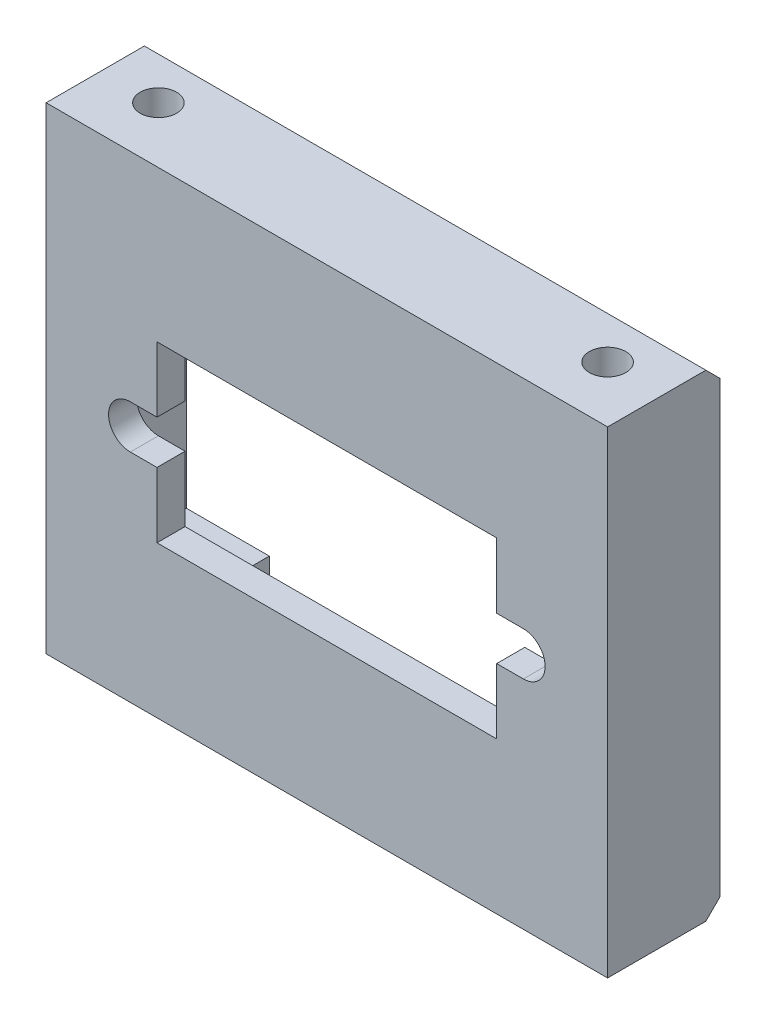
ISO-10303-21;
HEADER;
FILE_DESCRIPTION(('STEP AP214'),'2;1');
FILE_NAME('part.step','',(''),(''),'','','');
FILE_SCHEMA(('AUTOMOTIVE_DESIGN { 1 0 10303 214 1 1 1 1 }'));
ENDSEC;
DATA;
#1=APPLICATION_CONTEXT('core data for automotive mechanical design processes');
#2=APPLICATION_PROTOCOL_DEFINITION('international standard','automotive_design',2000,#1);
#3=PRODUCT_CONTEXT('',#1,'mechanical');
#4=PRODUCT('Part','Part','',(#3));
#5=PRODUCT_RELATED_PRODUCT_CATEGORY('part','',(#4));
#6=PRODUCT_DEFINITION_FORMATION('','',#4);
#7=PRODUCT_DEFINITION_CONTEXT('part definition',#1,'design');
#8=PRODUCT_DEFINITION('design','',#6,#7);
#9=PRODUCT_DEFINITION_SHAPE('','',#8);
#10=(LENGTH_UNIT() NAMED_UNIT(*) SI_UNIT(.MILLI.,.METRE.));
#11=(NAMED_UNIT(*) PLANE_ANGLE_UNIT() SI_UNIT($,.RADIAN.));
#12=(NAMED_UNIT(*) SI_UNIT($,.STERADIAN.) SOLID_ANGLE_UNIT());
#13=UNCERTAINTY_MEASURE_WITH_UNIT(LENGTH_MEASURE(1.E-05),#10,'distance_accuracy_value','');
#14=(GEOMETRIC_REPRESENTATION_CONTEXT(3) GLOBAL_UNCERTAINTY_ASSIGNED_CONTEXT((#13)) GLOBAL_UNIT_ASSIGNED_CONTEXT((#10,
#11,#12)) REPRESENTATION_CONTEXT('',''));
#15=CARTESIAN_POINT('',(0.,0.,0.));
#16=DIRECTION('',(0.,0.,1.));
#17=DIRECTION('',(1.,0.,0.));
#18=AXIS2_PLACEMENT_3D('',#15,#16,#17);
#19=CARTESIAN_POINT('',(0.,0.,0.));
#20=DIRECTION('',(0.,0.,1.));
#21=DIRECTION('',(1.,0.,0.));
#22=AXIS2_PLACEMENT_3D('',#19,#20,#21);
#23=PLANE('',#22);
#24=DIRECTION('',(0.,-1.,0.));
#25=VECTOR('',#24,1.);
#26=CARTESIAN_POINT('',(-12.1,6.2,0.));
#27=LINE('',#26,#25);
#28=CARTESIAN_POINT('',(-12.1,-1.55,0.));
#29=VERTEX_POINT('',#28);
#30=CARTESIAN_POINT('',(-12.1,-6.2,0.));
#31=VERTEX_POINT('',#30);
#32=EDGE_CURVE('E419',#29,#31,#27,.T.);
#33=ORIENTED_EDGE('',*,*,#32,.T.);
#34=DIRECTION('',(1.,0.,0.));
#35=VECTOR('',#34,1.);
#36=CARTESIAN_POINT('',(-12.1,-6.2,0.));
#37=LINE('',#36,#35);
#38=CARTESIAN_POINT('',(12.1,-6.2,0.));
#39=VERTEX_POINT('',#38);
#40=EDGE_CURVE('E418',#31,#39,#37,.T.);
#41=ORIENTED_EDGE('',*,*,#40,.T.);
#42=DIRECTION('',(0.,-1.,0.));
#43=VECTOR('',#42,1.);
#44=CARTESIAN_POINT('',(12.1,6.2,0.));
#45=LINE('',#44,#43);
#46=CARTESIAN_POINT('',(12.1,-1.55,0.));
#47=VERTEX_POINT('',#46);
#48=EDGE_CURVE('E423',#47,#39,#45,.T.);
#49=ORIENTED_EDGE('',*,*,#48,.F.);
#50=DIRECTION('',(1.,0.,0.));
#51=VECTOR('',#50,1.);
#52=CARTESIAN_POINT('',(0.,-1.55,0.));
#53=LINE('',#52,#51);
#54=CARTESIAN_POINT('',(14.,-1.55,0.));
#55=VERTEX_POINT('',#54);
#56=EDGE_CURVE('E343',#47,#55,#53,.T.);
#57=ORIENTED_EDGE('',*,*,#56,.T.);
#58=CARTESIAN_POINT('',(14.,0.,0.));
#59=DIRECTION('',(0.,0.,1.));
#60=DIRECTION('',(1.,0.,0.));
#61=AXIS2_PLACEMENT_3D('',#58,#59,#60);
#62=CIRCLE('',#61,1.55);
#63=CARTESIAN_POINT('',(14.,1.55,0.));
#64=VERTEX_POINT('',#63);
#65=EDGE_CURVE('E348',#64,#55,#62,.F.);
#66=ORIENTED_EDGE('',*,*,#65,.F.);
#67=DIRECTION('',(1.,0.,0.));
#68=VECTOR('',#67,1.);
#69=CARTESIAN_POINT('',(0.,1.55,0.));
#70=LINE('',#69,#68);
#71=CARTESIAN_POINT('',(12.1,1.55,0.));
#72=VERTEX_POINT('',#71);
#73=EDGE_CURVE('E340',#72,#64,#70,.T.);
#74=ORIENTED_EDGE('',*,*,#73,.F.);
#75=CARTESIAN_POINT('',(12.1,6.2,0.));
#76=VERTEX_POINT('',#75);
#77=EDGE_CURVE('E424',#76,#72,#45,.T.);
#78=ORIENTED_EDGE('',*,*,#77,.F.);
#79=DIRECTION('',(1.,0.,0.));
#80=VECTOR('',#79,1.);
#81=CARTESIAN_POINT('',(-12.1,6.2,0.));
#82=LINE('',#81,#80);
#83=CARTESIAN_POINT('',(-12.1,6.2,0.));
#84=VERTEX_POINT('',#83);
#85=EDGE_CURVE('E428',#84,#76,#82,.T.);
#86=ORIENTED_EDGE('',*,*,#85,.F.);
#87=CARTESIAN_POINT('',(-12.1,1.55,0.));
#88=VERTEX_POINT('',#87);
#89=EDGE_CURVE('E414',#84,#88,#27,.T.);
#90=ORIENTED_EDGE('',*,*,#89,.T.);
#91=DIRECTION('',(1.,0.,0.));
#92=VECTOR('',#91,1.);
#93=CARTESIAN_POINT('',(0.,1.55,0.));
#94=LINE('',#93,#92);
#95=CARTESIAN_POINT('',(-14.,1.55,0.));
#96=VERTEX_POINT('',#95);
#97=EDGE_CURVE('E378',#96,#88,#94,.T.);
#98=ORIENTED_EDGE('',*,*,#97,.F.);
#99=CARTESIAN_POINT('',(-14.,0.,0.));
#100=DIRECTION('',(0.,0.,1.));
#101=DIRECTION('',(1.,0.,0.));
#102=AXIS2_PLACEMENT_3D('',#99,#100,#101);
#103=CIRCLE('',#102,1.55);
#104=CARTESIAN_POINT('',(-14.,-1.55,0.));
#105=VERTEX_POINT('',#104);
#106=EDGE_CURVE('E382',#96,#105,#103,.T.);
#107=ORIENTED_EDGE('',*,*,#106,.T.);
#108=DIRECTION('',(1.,0.,0.));
#109=VECTOR('',#108,1.);
#110=CARTESIAN_POINT('',(0.,-1.55,0.));
#111=LINE('',#110,#109);
#112=EDGE_CURVE('E387',#105,#29,#111,.T.);
#113=ORIENTED_EDGE('',*,*,#112,.T.);
#114=EDGE_LOOP('',(#33,#41,#49,#57,#66,#74,#78,#86,#90,#98,#107,#113));
#115=FACE_BOUND('',#114,.T.);
#116=DIRECTION('',(1.,0.,0.));
#117=VECTOR('',#116,1.);
#118=CARTESIAN_POINT('',(18.,-11.02,0.));
#119=LINE('',#118,#117);
#120=CARTESIAN_POINT('',(12.1,-11.02,0.));
#121=VERTEX_POINT('',#120);
#122=CARTESIAN_POINT('',(18.,-11.02,0.));
#123=VERTEX_POINT('',#122);
#124=EDGE_CURVE('E725',#121,#123,#119,.T.);
#125=ORIENTED_EDGE('',*,*,#124,.F.);
#126=DIRECTION('',(0.,1.,0.));
#127=VECTOR('',#126,1.);
#128=CARTESIAN_POINT('',(12.1,-15.02,0.));
#129=LINE('',#128,#127);
#130=CARTESIAN_POINT('',(12.1,-15.02,0.));
#131=VERTEX_POINT('',#130);
#132=EDGE_CURVE('E708',#131,#121,#129,.T.);
#133=ORIENTED_EDGE('',*,*,#132,.F.);
#134=DIRECTION('',(1.,0.,0.));
#135=VECTOR('',#134,1.);
#136=CARTESIAN_POINT('',(18.,-15.02,0.));
#137=LINE('',#136,#135);
#138=CARTESIAN_POINT('',(-12.1,-15.02,0.));
#139=VERTEX_POINT('',#138);
#140=EDGE_CURVE('E308',#139,#131,#137,.T.);
#141=ORIENTED_EDGE('',*,*,#140,.F.);
#142=DIRECTION('',(0.,-1.,0.));
#143=VECTOR('',#142,1.);
#144=CARTESIAN_POINT('',(-12.1,-15.02,0.));
#145=LINE('',#144,#143);
#146=CARTESIAN_POINT('',(-12.1,-11.02,0.));
#147=VERTEX_POINT('',#146);
#148=EDGE_CURVE('E699',#147,#139,#145,.T.);
#149=ORIENTED_EDGE('',*,*,#148,.F.);
#150=DIRECTION('',(1.,0.,0.));
#151=VECTOR('',#150,1.);
#152=CARTESIAN_POINT('',(-18.,-11.02,0.));
#153=LINE('',#152,#151);
#154=CARTESIAN_POINT('',(-18.,-11.02,0.));
#155=VERTEX_POINT('',#154);
#156=EDGE_CURVE('E283',#155,#147,#153,.T.);
#157=ORIENTED_EDGE('',*,*,#156,.F.);
#158=DIRECTION('',(0.,-1.,0.));
#159=VECTOR('',#158,1.);
#160=CARTESIAN_POINT('',(-18.,17.,0.));
#161=LINE('',#160,#159);
#162=CARTESIAN_POINT('',(-18.,11.02,0.));
#163=VERTEX_POINT('',#162);
#164=EDGE_CURVE('E325',#163,#155,#161,.T.);
#165=ORIENTED_EDGE('',*,*,#164,.F.);
#166=DIRECTION('',(-1.,0.,0.));
#167=VECTOR('',#166,1.);
#168=CARTESIAN_POINT('',(-18.,11.02,0.));
#169=LINE('',#168,#167);
#170=CARTESIAN_POINT('',(-12.1,11.02,0.));
#171=VERTEX_POINT('',#170);
#172=EDGE_CURVE('E681',#171,#163,#169,.T.);
#173=ORIENTED_EDGE('',*,*,#172,.F.);
#174=DIRECTION('',(0.,-1.,0.));
#175=VECTOR('',#174,1.);
#176=CARTESIAN_POINT('',(-12.1,15.02,0.));
#177=LINE('',#176,#175);
#178=CARTESIAN_POINT('',(-12.1,15.02,0.));
#179=VERTEX_POINT('',#178);
#180=EDGE_CURVE('E684',#179,#171,#177,.T.);
#181=ORIENTED_EDGE('',*,*,#180,.F.);
#182=DIRECTION('',(-1.,0.,0.));
#183=VECTOR('',#182,1.);
#184=CARTESIAN_POINT('',(18.,15.02,0.));
#185=LINE('',#184,#183);
#186=CARTESIAN_POINT('',(12.1,15.02,0.));
#187=VERTEX_POINT('',#186);
#188=EDGE_CURVE('E292',#187,#179,#185,.T.);
#189=ORIENTED_EDGE('',*,*,#188,.F.);
#190=DIRECTION('',(0.,1.,0.));
#191=VECTOR('',#190,1.);
#192=CARTESIAN_POINT('',(12.1,15.02,0.));
#193=LINE('',#192,#191);
#194=CARTESIAN_POINT('',(12.1,11.02,0.));
#195=VERTEX_POINT('',#194);
#196=EDGE_CURVE('E739',#195,#187,#193,.T.);
#197=ORIENTED_EDGE('',*,*,#196,.F.);
#198=DIRECTION('',(-1.,0.,0.));
#199=VECTOR('',#198,1.);
#200=CARTESIAN_POINT('',(18.,11.02,0.));
#201=LINE('',#200,#199);
#202=CARTESIAN_POINT('',(18.,11.02,0.));
#203=VERTEX_POINT('',#202);
#204=EDGE_CURVE('E686',#203,#195,#201,.T.);
#205=ORIENTED_EDGE('',*,*,#204,.F.);
#206=DIRECTION('',(0.,1.,0.));
#207=VECTOR('',#206,1.);
#208=CARTESIAN_POINT('',(18.,17.,0.));
#209=LINE('',#208,#207);
#210=EDGE_CURVE('E333',#123,#203,#209,.T.);
#211=ORIENTED_EDGE('',*,*,#210,.F.);
#212=EDGE_LOOP('',(#125,#133,#141,#149,#157,#165,#173,#181,#189,#197,#205,#211));
#213=FACE_BOUND('',#212,.T.);
#214=ADVANCED_FACE('F71',(#115,#213),#23,.F.);
#215=CARTESIAN_POINT('',(18.,17.,-6.));
#216=DIRECTION('',(1.,0.,0.));
#217=DIRECTION('',(0.,1.,0.));
#218=AXIS2_PLACEMENT_3D('',#215,#216,#217);
#219=PLANE('',#218);
#220=DIRECTION('',(0.,0.,1.));
#221=VECTOR('',#220,1.);
#222=CARTESIAN_POINT('',(18.,-11.02,-13.1281133548787));
#223=LINE('',#222,#221);
#224=CARTESIAN_POINT('',(18.,-11.02,-6.));
#225=VERTEX_POINT('',#224);
#226=EDGE_CURVE('E721',#225,#123,#223,.T.);
#227=ORIENTED_EDGE('',*,*,#226,.T.);
#228=ORIENTED_EDGE('',*,*,#210,.T.);
#229=DIRECTION('',(0.,0.,1.));
#230=VECTOR('',#229,1.);
#231=CARTESIAN_POINT('',(18.,11.02,-13.1281133548787));
#232=LINE('',#231,#230);
#233=CARTESIAN_POINT('',(18.,11.02,-6.));
#234=VERTEX_POINT('',#233);
#235=EDGE_CURVE('E733',#234,#203,#232,.T.);
#236=ORIENTED_EDGE('',*,*,#235,.F.);
#237=DIRECTION('',(0.,1.,0.));
#238=VECTOR('',#237,1.);
#239=CARTESIAN_POINT('',(18.,17.,-6.));
#240=LINE('',#239,#238);
#241=EDGE_CURVE('E301',#225,#234,#240,.T.);
#242=ORIENTED_EDGE('',*,*,#241,.F.);
#243=EDGE_LOOP('',(#227,#228,#236,#242));
#244=FACE_BOUND('',#243,.T.);
#245=ADVANCED_FACE('F554',(#244),#219,.F.);
#246=CARTESIAN_POINT('',(-18.,17.,-6.));
#247=DIRECTION('',(-1.,0.,0.));
#248=DIRECTION('',(0.,-1.,0.));
#249=AXIS2_PLACEMENT_3D('',#246,#247,#248);
#250=PLANE('',#249);
#251=DIRECTION('',(0.,0.,1.));
#252=VECTOR('',#251,1.);
#253=CARTESIAN_POINT('',(-18.,-11.02,-13.1281133548787));
#254=LINE('',#253,#252);
#255=CARTESIAN_POINT('',(-18.,-11.02,-6.));
#256=VERTEX_POINT('',#255);
#257=EDGE_CURVE('E688',#256,#155,#254,.T.);
#258=ORIENTED_EDGE('',*,*,#257,.F.);
#259=DIRECTION('',(0.,-1.,0.));
#260=VECTOR('',#259,1.);
#261=CARTESIAN_POINT('',(-18.,17.,-6.));
#262=LINE('',#261,#260);
#263=CARTESIAN_POINT('',(-18.,11.02,-6.));
#264=VERTEX_POINT('',#263);
#265=EDGE_CURVE('E324',#264,#256,#262,.T.);
#266=ORIENTED_EDGE('',*,*,#265,.F.);
#267=DIRECTION('',(0.,0.,1.));
#268=VECTOR('',#267,1.);
#269=CARTESIAN_POINT('',(-18.,11.02,-13.1281133548787));
#270=LINE('',#269,#268);
#271=EDGE_CURVE('E677',#264,#163,#270,.T.);
#272=ORIENTED_EDGE('',*,*,#271,.T.);
#273=ORIENTED_EDGE('',*,*,#164,.T.);
#274=EDGE_LOOP('',(#258,#266,#272,#273));
#275=FACE_BOUND('',#274,.T.);
#276=ADVANCED_FACE('F560',(#275),#250,.F.);
#277=CARTESIAN_POINT('',(18.,-15.02,-42.0544088843514));
#278=DIRECTION('',(0.,-1.,0.));
#279=DIRECTION('',(0.,0.,-1.));
#280=AXIS2_PLACEMENT_3D('',#277,#278,#279);
#281=PLANE('',#280);
#282=DIRECTION('',(0.,0.,1.));
#283=VECTOR('',#282,1.);
#284=CARTESIAN_POINT('',(12.1,-15.02,-13.1281133548787));
#285=LINE('',#284,#283);
#286=CARTESIAN_POINT('',(12.1,-15.02,-6.));
#287=VERTEX_POINT('',#286);
#288=EDGE_CURVE('E715',#287,#131,#285,.T.);
#289=ORIENTED_EDGE('',*,*,#288,.F.);
#290=DIRECTION('',(1.,0.,0.));
#291=VECTOR('',#290,1.);
#292=CARTESIAN_POINT('',(18.,-15.02,-6.));
#293=LINE('',#292,#291);
#294=CARTESIAN_POINT('',(-12.1,-15.02,-6.));
#295=VERTEX_POINT('',#294);
#296=EDGE_CURVE('E312',#295,#287,#293,.T.);
#297=ORIENTED_EDGE('',*,*,#296,.F.);
#298=DIRECTION('',(0.,0.,1.));
#299=VECTOR('',#298,1.);
#300=CARTESIAN_POINT('',(-12.1,-15.02,-13.1281133548787));
#301=LINE('',#300,#299);
#302=EDGE_CURVE('E695',#295,#139,#301,.T.);
#303=ORIENTED_EDGE('',*,*,#302,.T.);
#304=ORIENTED_EDGE('',*,*,#140,.T.);
#305=EDGE_LOOP('',(#289,#297,#303,#304));
#306=FACE_BOUND('',#305,.T.);
#307=ADVANCED_FACE('F607',(#306),#281,.F.);
#308=CARTESIAN_POINT('',(18.,15.02,-42.0544088843514));
#309=DIRECTION('',(0.,1.,0.));
#310=DIRECTION('',(-1.,0.,0.));
#311=AXIS2_PLACEMENT_3D('',#308,#309,#310);
#312=PLANE('',#311);
#313=DIRECTION('',(0.,0.,1.));
#314=VECTOR('',#313,1.);
#315=CARTESIAN_POINT('',(-12.1,15.02,-13.1281133548787));
#316=LINE('',#315,#314);
#317=CARTESIAN_POINT('',(-12.1,15.02,-6.));
#318=VERTEX_POINT('',#317);
#319=EDGE_CURVE('E275',#318,#179,#316,.T.);
#320=ORIENTED_EDGE('',*,*,#319,.F.);
#321=DIRECTION('',(-1.,0.,0.));
#322=VECTOR('',#321,1.);
#323=CARTESIAN_POINT('',(18.,15.02,-6.));
#324=LINE('',#323,#322);
#325=CARTESIAN_POINT('',(12.1,15.02,-6.));
#326=VERTEX_POINT('',#325);
#327=EDGE_CURVE('E290',#326,#318,#324,.T.);
#328=ORIENTED_EDGE('',*,*,#327,.F.);
#329=DIRECTION('',(0.,0.,1.));
#330=VECTOR('',#329,1.);
#331=CARTESIAN_POINT('',(12.1,15.02,-13.1281133548787));
#332=LINE('',#331,#330);
#333=EDGE_CURVE('E742',#326,#187,#332,.T.);
#334=ORIENTED_EDGE('',*,*,#333,.T.);
#335=ORIENTED_EDGE('',*,*,#188,.T.);
#336=EDGE_LOOP('',(#320,#328,#334,#335));
#337=FACE_BOUND('',#336,.T.);
#338=ADVANCED_FACE('F288',(#337),#312,.F.);
#339=CARTESIAN_POINT('',(20.,17.,2.));
#340=DIRECTION('',(-1.,0.,0.));
#341=DIRECTION('',(0.,-1.,0.));
#342=AXIS2_PLACEMENT_3D('',#339,#340,#341);
#343=PLANE('',#342);
#344=DIRECTION('',(0.,-1.,0.));
#345=VECTOR('',#344,1.);
#346=CARTESIAN_POINT('',(20.,17.,-6.));
#347=LINE('',#346,#345);
#348=CARTESIAN_POINT('',(20.,16.,-6.));
#349=VERTEX_POINT('',#348);
#350=CARTESIAN_POINT('',(20.,-16.,-6.));
#351=VERTEX_POINT('',#350);
#352=EDGE_CURVE('E306',#349,#351,#347,.T.);
#353=ORIENTED_EDGE('',*,*,#352,.F.);
#354=DIRECTION('',(0.,-0.707106781186548,-0.707106781186548));
#355=VECTOR('',#354,1.);
#356=CARTESIAN_POINT('',(20.,16.,-6.));
#357=LINE('',#356,#355);
#358=CARTESIAN_POINT('',(20.,17.,-4.99999999999999));
#359=VERTEX_POINT('',#358);
#360=EDGE_CURVE('E508',#349,#359,#357,.F.);
#361=ORIENTED_EDGE('',*,*,#360,.T.);
#362=DIRECTION('',(0.,0.,-1.));
#363=VECTOR('',#362,1.);
#364=CARTESIAN_POINT('',(20.,17.,2.));
#365=LINE('',#364,#363);
#366=CARTESIAN_POINT('',(20.,17.,2.));
#367=VERTEX_POINT('',#366);
#368=EDGE_CURVE('E483',#367,#359,#365,.T.);
#369=ORIENTED_EDGE('',*,*,#368,.F.);
#370=DIRECTION('',(0.,1.,0.));
#371=VECTOR('',#370,1.);
#372=CARTESIAN_POINT('',(20.,17.,2.));
#373=LINE('',#372,#371);
#374=CARTESIAN_POINT('',(20.,-17.,2.));
#375=VERTEX_POINT('',#374);
#376=EDGE_CURVE('E368',#375,#367,#373,.T.);
#377=ORIENTED_EDGE('',*,*,#376,.F.);
#378=DIRECTION('',(0.,0.,-1.));
#379=VECTOR('',#378,1.);
#380=CARTESIAN_POINT('',(20.,-17.,2.));
#381=LINE('',#380,#379);
#382=CARTESIAN_POINT('',(20.,-17.,-4.99999999999999));
#383=VERTEX_POINT('',#382);
#384=EDGE_CURVE('E473',#375,#383,#381,.T.);
#385=ORIENTED_EDGE('',*,*,#384,.T.);
#386=DIRECTION('',(0.,-0.707106781186548,0.707106781186548));
#387=VECTOR('',#386,1.);
#388=CARTESIAN_POINT('',(20.,-16.,-6.));
#389=LINE('',#388,#387);
#390=EDGE_CURVE('E505',#383,#351,#389,.F.);
#391=ORIENTED_EDGE('',*,*,#390,.T.);
#392=EDGE_LOOP('',(#353,#361,#369,#377,#385,#391));
#393=FACE_BOUND('',#392,.T.);
#394=ADVANCED_FACE('F525',(#393),#343,.F.);
#395=CARTESIAN_POINT('',(-20.,17.,2.));
#396=DIRECTION('',(0.,-1.,0.));
#397=DIRECTION('',(0.,0.,-1.));
#398=AXIS2_PLACEMENT_3D('',#395,#396,#397);
#399=PLANE('',#398);
#400=CARTESIAN_POINT('',(-16.,17.,-2.));
#401=DIRECTION('',(0.,1.,0.));
#402=DIRECTION('',(0.,0.,1.));
#403=AXIS2_PLACEMENT_3D('',#400,#401,#402);
#404=CIRCLE('',#403,1.3);
#405=CARTESIAN_POINT('',(-16.,17.,-0.699999999999996));
#406=VERTEX_POINT('',#405);
#407=EDGE_CURVE('E661',#406,#406,#404,.T.);
#408=ORIENTED_EDGE('',*,*,#407,.F.);
#409=EDGE_LOOP('',(#408));
#410=FACE_BOUND('',#409,.T.);
#411=CARTESIAN_POINT('',(16.,17.,-2.));
#412=DIRECTION('',(0.,1.,0.));
#413=DIRECTION('',(0.,0.,1.));
#414=AXIS2_PLACEMENT_3D('',#411,#412,#413);
#415=CIRCLE('',#414,1.3);
#416=CARTESIAN_POINT('',(16.,17.,-0.699999999999998));
#417=VERTEX_POINT('',#416);
#418=EDGE_CURVE('E780',#417,#417,#415,.T.);
#419=ORIENTED_EDGE('',*,*,#418,.F.);
#420=EDGE_LOOP('',(#419));
#421=FACE_BOUND('',#420,.T.);
#422=ORIENTED_EDGE('',*,*,#368,.T.);
#423=DIRECTION('',(-1.,0.,0.));
#424=VECTOR('',#423,1.);
#425=CARTESIAN_POINT('',(-20.,17.,-4.99999999999999));
#426=LINE('',#425,#424);
#427=CARTESIAN_POINT('',(-20.,17.,-4.99999999999999));
#428=VERTEX_POINT('',#427);
#429=EDGE_CURVE('E96',#359,#428,#426,.T.);
#430=ORIENTED_EDGE('',*,*,#429,.T.);
#431=DIRECTION('',(0.,0.,-1.));
#432=VECTOR('',#431,1.);
#433=CARTESIAN_POINT('',(-20.,17.,2.));
#434=LINE('',#433,#432);
#435=CARTESIAN_POINT('',(-20.,17.,2.));
#436=VERTEX_POINT('',#435);
#437=EDGE_CURVE('E480',#436,#428,#434,.T.);
#438=ORIENTED_EDGE('',*,*,#437,.F.);
#439=DIRECTION('',(-1.,0.,0.));
#440=VECTOR('',#439,1.);
#441=CARTESIAN_POINT('',(-20.,17.,2.));
#442=LINE('',#441,#440);
#443=EDGE_CURVE('E464',#367,#436,#442,.T.);
#444=ORIENTED_EDGE('',*,*,#443,.F.);
#445=EDGE_LOOP('',(#422,#430,#438,#444));
#446=FACE_BOUND('',#445,.T.);
#447=ADVANCED_FACE('F527',(#410,#421,#446),#399,.F.);
#448=CARTESIAN_POINT('',(-20.,17.,2.));
#449=DIRECTION('',(1.,0.,0.));
#450=DIRECTION('',(0.,1.,0.));
#451=AXIS2_PLACEMENT_3D('',#448,#449,#450);
#452=PLANE('',#451);
#453=ORIENTED_EDGE('',*,*,#437,.T.);
#454=DIRECTION('',(0.,0.707106781186548,0.707106781186548));
#455=VECTOR('',#454,1.);
#456=CARTESIAN_POINT('',(-20.,16.,-6.));
#457=LINE('',#456,#455);
#458=CARTESIAN_POINT('',(-20.,16.,-6.));
#459=VERTEX_POINT('',#458);
#460=EDGE_CURVE('E81',#428,#459,#457,.F.);
#461=ORIENTED_EDGE('',*,*,#460,.T.);
#462=DIRECTION('',(0.,1.,0.));
#463=VECTOR('',#462,1.);
#464=CARTESIAN_POINT('',(-20.,17.,-6.));
#465=LINE('',#464,#463);
#466=CARTESIAN_POINT('',(-20.,-16.,-6.));
#467=VERTEX_POINT('',#466);
#468=EDGE_CURVE('E320',#467,#459,#465,.T.);
#469=ORIENTED_EDGE('',*,*,#468,.F.);
#470=DIRECTION('',(0.,0.707106781186548,-0.707106781186548));
#471=VECTOR('',#470,1.);
#472=CARTESIAN_POINT('',(-20.,-16.,-6.));
#473=LINE('',#472,#471);
#474=CARTESIAN_POINT('',(-20.,-17.,-4.99999999999999));
#475=VERTEX_POINT('',#474);
#476=EDGE_CURVE('E88',#467,#475,#473,.F.);
#477=ORIENTED_EDGE('',*,*,#476,.T.);
#478=DIRECTION('',(0.,0.,-1.));
#479=VECTOR('',#478,1.);
#480=CARTESIAN_POINT('',(-20.,-17.,2.));
#481=LINE('',#480,#479);
#482=CARTESIAN_POINT('',(-20.,-17.,2.));
#483=VERTEX_POINT('',#482);
#484=EDGE_CURVE('E477',#483,#475,#481,.T.);
#485=ORIENTED_EDGE('',*,*,#484,.F.);
#486=DIRECTION('',(0.,-1.,0.));
#487=VECTOR('',#486,1.);
#488=CARTESIAN_POINT('',(-20.,17.,2.));
#489=LINE('',#488,#487);
#490=EDGE_CURVE('E467',#436,#483,#489,.T.);
#491=ORIENTED_EDGE('',*,*,#490,.F.);
#492=EDGE_LOOP('',(#453,#461,#469,#477,#485,#491));
#493=FACE_BOUND('',#492,.T.);
#494=ADVANCED_FACE('F516',(#493),#452,.F.);
#495=CARTESIAN_POINT('',(-20.,-17.,2.));
#496=DIRECTION('',(0.,1.,0.));
#497=DIRECTION('',(0.,0.,1.));
#498=AXIS2_PLACEMENT_3D('',#495,#496,#497);
#499=PLANE('',#498);
#500=CARTESIAN_POINT('',(-16.,-17.,-2.));
#501=DIRECTION('',(0.,1.,0.));
#502=DIRECTION('',(0.,0.,1.));
#503=AXIS2_PLACEMENT_3D('',#500,#501,#502);
#504=CIRCLE('',#503,1.3);
#505=CARTESIAN_POINT('',(-16.,-17.,-0.699999999999996));
#506=VERTEX_POINT('',#505);
#507=EDGE_CURVE('E492',#506,#506,#504,.T.);
#508=ORIENTED_EDGE('',*,*,#507,.T.);
#509=EDGE_LOOP('',(#508));
#510=FACE_BOUND('',#509,.T.);
#511=CARTESIAN_POINT('',(16.,-17.,-2.));
#512=DIRECTION('',(0.,1.,0.));
#513=DIRECTION('',(0.,0.,1.));
#514=AXIS2_PLACEMENT_3D('',#511,#512,#513);
#515=CIRCLE('',#514,1.3);
#516=CARTESIAN_POINT('',(16.,-17.,-0.699999999999998));
#517=VERTEX_POINT('',#516);
#518=EDGE_CURVE('E776',#517,#517,#515,.T.);
#519=ORIENTED_EDGE('',*,*,#518,.T.);
#520=EDGE_LOOP('',(#519));
#521=FACE_BOUND('',#520,.T.);
#522=ORIENTED_EDGE('',*,*,#484,.T.);
#523=DIRECTION('',(1.,0.,0.));
#524=VECTOR('',#523,1.);
#525=CARTESIAN_POINT('',(-20.,-17.,-4.99999999999999));
#526=LINE('',#525,#524);
#527=EDGE_CURVE('E12',#475,#383,#526,.T.);
#528=ORIENTED_EDGE('',*,*,#527,.T.);
#529=ORIENTED_EDGE('',*,*,#384,.F.);
#530=DIRECTION('',(1.,0.,0.));
#531=VECTOR('',#530,1.);
#532=CARTESIAN_POINT('',(-20.,-17.,2.));
#533=LINE('',#532,#531);
#534=EDGE_CURVE('E470',#483,#375,#533,.T.);
#535=ORIENTED_EDGE('',*,*,#534,.F.);
#536=EDGE_LOOP('',(#522,#528,#529,#535));
#537=FACE_BOUND('',#536,.T.);
#538=ADVANCED_FACE('F536',(#510,#521,#537),#499,.F.);
#539=CARTESIAN_POINT('',(0.,0.,2.));
#540=DIRECTION('',(0.,0.,1.));
#541=DIRECTION('',(1.,0.,0.));
#542=AXIS2_PLACEMENT_3D('',#539,#540,#541);
#543=PLANE('',#542);
#544=DIRECTION('',(1.,0.,0.));
#545=VECTOR('',#544,1.);
#546=CARTESIAN_POINT('',(-12.1,-6.2,2.));
#547=LINE('',#546,#545);
#548=CARTESIAN_POINT('',(-12.1,-6.2,2.));
#549=VERTEX_POINT('',#548);
#550=CARTESIAN_POINT('',(12.1,-6.2,2.));
#551=VERTEX_POINT('',#550);
#552=EDGE_CURVE('E437',#549,#551,#547,.T.);
#553=ORIENTED_EDGE('',*,*,#552,.F.);
#554=DIRECTION('',(0.,-1.,0.));
#555=VECTOR('',#554,1.);
#556=CARTESIAN_POINT('',(-12.1,6.2,2.));
#557=LINE('',#556,#555);
#558=CARTESIAN_POINT('',(-12.1,-1.55,2.));
#559=VERTEX_POINT('',#558);
#560=EDGE_CURVE('E329',#559,#549,#557,.T.);
#561=ORIENTED_EDGE('',*,*,#560,.F.);
#562=DIRECTION('',(1.,0.,0.));
#563=VECTOR('',#562,1.);
#564=CARTESIAN_POINT('',(0.,-1.55,2.));
#565=LINE('',#564,#563);
#566=CARTESIAN_POINT('',(-14.,-1.55,2.));
#567=VERTEX_POINT('',#566);
#568=EDGE_CURVE('E383',#567,#559,#565,.T.);
#569=ORIENTED_EDGE('',*,*,#568,.F.);
#570=CARTESIAN_POINT('',(-14.,0.,2.));
#571=DIRECTION('',(0.,0.,1.));
#572=DIRECTION('',(1.,0.,0.));
#573=AXIS2_PLACEMENT_3D('',#570,#571,#572);
#574=CIRCLE('',#573,1.55);
#575=CARTESIAN_POINT('',(-14.,1.55,2.));
#576=VERTEX_POINT('',#575);
#577=EDGE_CURVE('E396',#576,#567,#574,.T.);
#578=ORIENTED_EDGE('',*,*,#577,.F.);
#579=DIRECTION('',(1.,0.,0.));
#580=VECTOR('',#579,1.);
#581=CARTESIAN_POINT('',(0.,1.55,2.));
#582=LINE('',#581,#580);
#583=CARTESIAN_POINT('',(-12.1,1.55,2.));
#584=VERTEX_POINT('',#583);
#585=EDGE_CURVE('E392',#576,#584,#582,.T.);
#586=ORIENTED_EDGE('',*,*,#585,.T.);
#587=CARTESIAN_POINT('',(-12.1,6.2,2.));
#588=VERTEX_POINT('',#587);
#589=EDGE_CURVE('E433',#588,#584,#557,.T.);
#590=ORIENTED_EDGE('',*,*,#589,.F.);
#591=DIRECTION('',(1.,0.,0.));
#592=VECTOR('',#591,1.);
#593=CARTESIAN_POINT('',(-12.1,6.2,2.));
#594=LINE('',#593,#592);
#595=CARTESIAN_POINT('',(12.1,6.2,2.));
#596=VERTEX_POINT('',#595);
#597=EDGE_CURVE('E446',#588,#596,#594,.T.);
#598=ORIENTED_EDGE('',*,*,#597,.T.);
#599=DIRECTION('',(0.,-1.,0.));
#600=VECTOR('',#599,1.);
#601=CARTESIAN_POINT('',(12.1,6.2,2.));
#602=LINE('',#601,#600);
#603=CARTESIAN_POINT('',(12.1,1.55,2.));
#604=VERTEX_POINT('',#603);
#605=EDGE_CURVE('E442',#596,#604,#602,.T.);
#606=ORIENTED_EDGE('',*,*,#605,.T.);
#607=DIRECTION('',(1.,0.,0.));
#608=VECTOR('',#607,1.);
#609=CARTESIAN_POINT('',(0.,1.55,2.));
#610=LINE('',#609,#608);
#611=CARTESIAN_POINT('',(14.,1.55,2.));
#612=VERTEX_POINT('',#611);
#613=EDGE_CURVE('E352',#604,#612,#610,.T.);
#614=ORIENTED_EDGE('',*,*,#613,.T.);
#615=CARTESIAN_POINT('',(14.,0.,2.));
#616=DIRECTION('',(0.,0.,1.));
#617=DIRECTION('',(1.,0.,0.));
#618=AXIS2_PLACEMENT_3D('',#615,#616,#617);
#619=CIRCLE('',#618,1.55);
#620=CARTESIAN_POINT('',(14.,-1.55,2.));
#621=VERTEX_POINT('',#620);
#622=EDGE_CURVE('E344',#612,#621,#619,.F.);
#623=ORIENTED_EDGE('',*,*,#622,.T.);
#624=DIRECTION('',(1.,0.,0.));
#625=VECTOR('',#624,1.);
#626=CARTESIAN_POINT('',(0.,-1.55,2.));
#627=LINE('',#626,#625);
#628=CARTESIAN_POINT('',(12.1,-1.55,2.));
#629=VERTEX_POINT('',#628);
#630=EDGE_CURVE('E356',#629,#621,#627,.T.);
#631=ORIENTED_EDGE('',*,*,#630,.F.);
#632=EDGE_CURVE('E441',#629,#551,#602,.T.);
#633=ORIENTED_EDGE('',*,*,#632,.T.);
#634=EDGE_LOOP('',(#553,#561,#569,#578,#586,#590,#598,#606,#614,#623,#631,#633));
#635=FACE_BOUND('',#634,.T.);
#636=ORIENTED_EDGE('',*,*,#376,.T.);
#637=ORIENTED_EDGE('',*,*,#443,.T.);
#638=ORIENTED_EDGE('',*,*,#490,.T.);
#639=ORIENTED_EDGE('',*,*,#534,.T.);
#640=EDGE_LOOP('',(#636,#637,#638,#639));
#641=FACE_BOUND('',#640,.T.);
#642=ADVANCED_FACE('F529',(#635,#641),#543,.T.);
#643=CARTESIAN_POINT('',(0.,1.55,0.));
#644=DIRECTION('',(0.,-1.,0.));
#645=DIRECTION('',(0.,0.,-1.));
#646=AXIS2_PLACEMENT_3D('',#643,#644,#645);
#647=PLANE('',#646);
#648=ORIENTED_EDGE('',*,*,#613,.F.);
#649=DIRECTION('',(0.,0.,1.));
#650=VECTOR('',#649,1.);
#651=CARTESIAN_POINT('',(12.1,1.55,0.));
#652=LINE('',#651,#650);
#653=EDGE_CURVE('E351',#72,#604,#652,.T.);
#654=ORIENTED_EDGE('',*,*,#653,.F.);
#655=ORIENTED_EDGE('',*,*,#73,.T.);
#656=DIRECTION('',(0.,0.,1.));
#657=VECTOR('',#656,1.);
#658=CARTESIAN_POINT('',(14.,1.55,0.));
#659=LINE('',#658,#657);
#660=EDGE_CURVE('E364',#64,#612,#659,.T.);
#661=ORIENTED_EDGE('',*,*,#660,.T.);
#662=EDGE_LOOP('',(#648,#654,#655,#661));
#663=FACE_BOUND('',#662,.T.);
#664=ADVANCED_FACE('F545',(#663),#647,.T.);
#665=CARTESIAN_POINT('',(14.,0.,0.));
#666=DIRECTION('',(0.,0.,1.));
#667=DIRECTION('',(1.,0.,0.));
#668=AXIS2_PLACEMENT_3D('',#665,#666,#667);
#669=CYLINDRICAL_SURFACE('',#668,1.55);
#670=ORIENTED_EDGE('',*,*,#622,.F.);
#671=ORIENTED_EDGE('',*,*,#660,.F.);
#672=ORIENTED_EDGE('',*,*,#65,.T.);
#673=DIRECTION('',(0.,0.,1.));
#674=VECTOR('',#673,1.);
#675=CARTESIAN_POINT('',(14.,-1.55,0.));
#676=LINE('',#675,#674);
#677=EDGE_CURVE('E369',#55,#621,#676,.T.);
#678=ORIENTED_EDGE('',*,*,#677,.T.);
#679=EDGE_LOOP('',(#670,#671,#672,#678));
#680=FACE_BOUND('',#679,.T.);
#681=ADVANCED_FACE('F597',(#680),#669,.F.);
#682=CARTESIAN_POINT('',(0.,-1.55,0.));
#683=DIRECTION('',(0.,-1.,0.));
#684=DIRECTION('',(0.,0.,-1.));
#685=AXIS2_PLACEMENT_3D('',#682,#683,#684);
#686=PLANE('',#685);
#687=ORIENTED_EDGE('',*,*,#630,.T.);
#688=ORIENTED_EDGE('',*,*,#677,.F.);
#689=ORIENTED_EDGE('',*,*,#56,.F.);
#690=DIRECTION('',(0.,0.,1.));
#691=VECTOR('',#690,1.);
#692=CARTESIAN_POINT('',(12.1,-1.55,0.));
#693=LINE('',#692,#691);
#694=EDGE_CURVE('E372',#47,#629,#693,.T.);
#695=ORIENTED_EDGE('',*,*,#694,.T.);
#696=EDGE_LOOP('',(#687,#688,#689,#695));
#697=FACE_BOUND('',#696,.T.);
#698=ADVANCED_FACE('F590',(#697),#686,.F.);
#699=CARTESIAN_POINT('',(-14.,0.,0.));
#700=DIRECTION('',(0.,0.,1.));
#701=DIRECTION('',(1.,0.,0.));
#702=AXIS2_PLACEMENT_3D('',#699,#700,#701);
#703=CYLINDRICAL_SURFACE('',#702,1.55);
#704=ORIENTED_EDGE('',*,*,#577,.T.);
#705=DIRECTION('',(0.,0.,1.));
#706=VECTOR('',#705,1.);
#707=CARTESIAN_POINT('',(-14.,-1.55,0.));
#708=LINE('',#707,#706);
#709=EDGE_CURVE('E409',#105,#567,#708,.T.);
#710=ORIENTED_EDGE('',*,*,#709,.F.);
#711=ORIENTED_EDGE('',*,*,#106,.F.);
#712=DIRECTION('',(0.,0.,1.));
#713=VECTOR('',#712,1.);
#714=CARTESIAN_POINT('',(-14.,1.55,0.));
#715=LINE('',#714,#713);
#716=EDGE_CURVE('E391',#96,#576,#715,.T.);
#717=ORIENTED_EDGE('',*,*,#716,.T.);
#718=EDGE_LOOP('',(#704,#710,#711,#717));
#719=FACE_BOUND('',#718,.T.);
#720=ADVANCED_FACE('F587',(#719),#703,.F.);
#721=CARTESIAN_POINT('',(0.,-1.55,0.));
#722=DIRECTION('',(0.,-1.,0.));
#723=DIRECTION('',(0.,0.,-1.));
#724=AXIS2_PLACEMENT_3D('',#721,#722,#723);
#725=PLANE('',#724);
#726=ORIENTED_EDGE('',*,*,#568,.T.);
#727=DIRECTION('',(0.,0.,1.));
#728=VECTOR('',#727,1.);
#729=CARTESIAN_POINT('',(-12.1,-1.55,0.));
#730=LINE('',#729,#728);
#731=EDGE_CURVE('E406',#29,#559,#730,.T.);
#732=ORIENTED_EDGE('',*,*,#731,.F.);
#733=ORIENTED_EDGE('',*,*,#112,.F.);
#734=ORIENTED_EDGE('',*,*,#709,.T.);
#735=EDGE_LOOP('',(#726,#732,#733,#734));
#736=FACE_BOUND('',#735,.T.);
#737=ADVANCED_FACE('F585',(#736),#725,.F.);
#738=CARTESIAN_POINT('',(0.,1.55,0.));
#739=DIRECTION('',(0.,-1.,0.));
#740=DIRECTION('',(0.,0.,-1.));
#741=AXIS2_PLACEMENT_3D('',#738,#739,#740);
#742=PLANE('',#741);
#743=ORIENTED_EDGE('',*,*,#585,.F.);
#744=ORIENTED_EDGE('',*,*,#716,.F.);
#745=ORIENTED_EDGE('',*,*,#97,.T.);
#746=DIRECTION('',(0.,0.,1.));
#747=VECTOR('',#746,1.);
#748=CARTESIAN_POINT('',(-12.1,1.55,0.));
#749=LINE('',#748,#747);
#750=EDGE_CURVE('E357',#88,#584,#749,.T.);
#751=ORIENTED_EDGE('',*,*,#750,.T.);
#752=EDGE_LOOP('',(#743,#744,#745,#751));
#753=FACE_BOUND('',#752,.T.);
#754=ADVANCED_FACE('F576',(#753),#742,.T.);
#755=CARTESIAN_POINT('',(-12.1,6.2,0.));
#756=DIRECTION('',(-1.,0.,0.));
#757=DIRECTION('',(0.,0.,1.));
#758=AXIS2_PLACEMENT_3D('',#755,#756,#757);
#759=PLANE('',#758);
#760=ORIENTED_EDGE('',*,*,#731,.T.);
#761=ORIENTED_EDGE('',*,*,#560,.T.);
#762=DIRECTION('',(0.,0.,1.));
#763=VECTOR('',#762,1.);
#764=CARTESIAN_POINT('',(-12.1,-6.2,0.));
#765=LINE('',#764,#763);
#766=EDGE_CURVE('E432',#31,#549,#765,.T.);
#767=ORIENTED_EDGE('',*,*,#766,.F.);
#768=ORIENTED_EDGE('',*,*,#32,.F.);
#769=EDGE_LOOP('',(#760,#761,#767,#768));
#770=FACE_BOUND('',#769,.T.);
#771=ADVANCED_FACE('F570',(#770),#759,.F.);
#772=ORIENTED_EDGE('',*,*,#89,.F.);
#773=DIRECTION('',(0.,0.,1.));
#774=VECTOR('',#773,1.);
#775=CARTESIAN_POINT('',(-12.1,6.2,0.));
#776=LINE('',#775,#774);
#777=EDGE_CURVE('E397',#84,#588,#776,.T.);
#778=ORIENTED_EDGE('',*,*,#777,.T.);
#779=ORIENTED_EDGE('',*,*,#589,.T.);
#780=ORIENTED_EDGE('',*,*,#750,.F.);
#781=EDGE_LOOP('',(#772,#778,#779,#780));
#782=FACE_BOUND('',#781,.T.);
#783=ADVANCED_FACE('F566',(#782),#759,.F.);
#784=CARTESIAN_POINT('',(-12.1,6.2,0.));
#785=DIRECTION('',(0.,-1.,0.));
#786=DIRECTION('',(0.,0.,-1.));
#787=AXIS2_PLACEMENT_3D('',#784,#785,#786);
#788=PLANE('',#787);
#789=ORIENTED_EDGE('',*,*,#597,.F.);
#790=ORIENTED_EDGE('',*,*,#777,.F.);
#791=ORIENTED_EDGE('',*,*,#85,.T.);
#792=DIRECTION('',(0.,0.,1.));
#793=VECTOR('',#792,1.);
#794=CARTESIAN_POINT('',(12.1,6.2,0.));
#795=LINE('',#794,#793);
#796=EDGE_CURVE('E452',#76,#596,#795,.T.);
#797=ORIENTED_EDGE('',*,*,#796,.T.);
#798=EDGE_LOOP('',(#789,#790,#791,#797));
#799=FACE_BOUND('',#798,.T.);
#800=ADVANCED_FACE('F569',(#799),#788,.T.);
#801=CARTESIAN_POINT('',(-12.1,-6.2,0.));
#802=DIRECTION('',(0.,-1.,0.));
#803=DIRECTION('',(0.,0.,-1.));
#804=AXIS2_PLACEMENT_3D('',#801,#802,#803);
#805=PLANE('',#804);
#806=ORIENTED_EDGE('',*,*,#552,.T.);
#807=DIRECTION('',(0.,0.,1.));
#808=VECTOR('',#807,1.);
#809=CARTESIAN_POINT('',(12.1,-6.2,0.));
#810=LINE('',#809,#808);
#811=EDGE_CURVE('E455',#39,#551,#810,.T.);
#812=ORIENTED_EDGE('',*,*,#811,.F.);
#813=ORIENTED_EDGE('',*,*,#40,.F.);
#814=ORIENTED_EDGE('',*,*,#766,.T.);
#815=EDGE_LOOP('',(#806,#812,#813,#814));
#816=FACE_BOUND('',#815,.T.);
#817=ADVANCED_FACE('F572',(#816),#805,.F.);
#818=CARTESIAN_POINT('',(12.1,6.2,0.));
#819=DIRECTION('',(-1.,0.,0.));
#820=DIRECTION('',(0.,0.,1.));
#821=AXIS2_PLACEMENT_3D('',#818,#819,#820);
#822=PLANE('',#821);
#823=ORIENTED_EDGE('',*,*,#48,.T.);
#824=ORIENTED_EDGE('',*,*,#811,.T.);
#825=ORIENTED_EDGE('',*,*,#632,.F.);
#826=ORIENTED_EDGE('',*,*,#694,.F.);
#827=EDGE_LOOP('',(#823,#824,#825,#826));
#828=FACE_BOUND('',#827,.T.);
#829=ADVANCED_FACE('F548',(#828),#822,.T.);
#830=ORIENTED_EDGE('',*,*,#653,.T.);
#831=ORIENTED_EDGE('',*,*,#605,.F.);
#832=ORIENTED_EDGE('',*,*,#796,.F.);
#833=ORIENTED_EDGE('',*,*,#77,.T.);
#834=EDGE_LOOP('',(#830,#831,#832,#833));
#835=FACE_BOUND('',#834,.T.);
#836=ADVANCED_FACE('F577',(#835),#822,.T.);
#837=CARTESIAN_POINT('',(0.,0.,-6.));
#838=DIRECTION('',(0.,0.,1.));
#839=DIRECTION('',(1.,0.,0.));
#840=AXIS2_PLACEMENT_3D('',#837,#838,#839);
#841=PLANE('',#840);
#842=DIRECTION('',(-1.,0.,0.));
#843=VECTOR('',#842,1.);
#844=CARTESIAN_POINT('',(18.,-11.02,-6.));
#845=LINE('',#844,#843);
#846=CARTESIAN_POINT('',(12.1,-11.02,-6.));
#847=VERTEX_POINT('',#846);
#848=EDGE_CURVE('E668',#225,#847,#845,.T.);
#849=ORIENTED_EDGE('',*,*,#848,.F.);
#850=ORIENTED_EDGE('',*,*,#241,.T.);
#851=DIRECTION('',(1.,0.,0.));
#852=VECTOR('',#851,1.);
#853=CARTESIAN_POINT('',(18.,11.02,-6.));
#854=LINE('',#853,#852);
#855=CARTESIAN_POINT('',(12.1,11.02,-6.));
#856=VERTEX_POINT('',#855);
#857=EDGE_CURVE('E316',#856,#234,#854,.T.);
#858=ORIENTED_EDGE('',*,*,#857,.F.);
#859=DIRECTION('',(0.,-1.,0.));
#860=VECTOR('',#859,1.);
#861=CARTESIAN_POINT('',(12.1,15.02,-6.));
#862=LINE('',#861,#860);
#863=EDGE_CURVE('E299',#326,#856,#862,.T.);
#864=ORIENTED_EDGE('',*,*,#863,.F.);
#865=ORIENTED_EDGE('',*,*,#327,.T.);
#866=DIRECTION('',(0.,1.,0.));
#867=VECTOR('',#866,1.);
#868=CARTESIAN_POINT('',(-12.1,15.02,-6.));
#869=LINE('',#868,#867);
#870=CARTESIAN_POINT('',(-12.1,11.02,-6.));
#871=VERTEX_POINT('',#870);
#872=EDGE_CURVE('E271',#871,#318,#869,.T.);
#873=ORIENTED_EDGE('',*,*,#872,.F.);
#874=DIRECTION('',(1.,0.,0.));
#875=VECTOR('',#874,1.);
#876=CARTESIAN_POINT('',(-18.,11.02,-6.));
#877=LINE('',#876,#875);
#878=EDGE_CURVE('E282',#264,#871,#877,.T.);
#879=ORIENTED_EDGE('',*,*,#878,.F.);
#880=ORIENTED_EDGE('',*,*,#265,.T.);
#881=DIRECTION('',(-1.,0.,0.));
#882=VECTOR('',#881,1.);
#883=CARTESIAN_POINT('',(-18.,-11.02,-6.));
#884=LINE('',#883,#882);
#885=CARTESIAN_POINT('',(-12.1,-11.02,-6.));
#886=VERTEX_POINT('',#885);
#887=EDGE_CURVE('E705',#886,#256,#884,.T.);
#888=ORIENTED_EDGE('',*,*,#887,.F.);
#889=DIRECTION('',(0.,1.,0.));
#890=VECTOR('',#889,1.);
#891=CARTESIAN_POINT('',(-12.1,-15.02,-6.));
#892=LINE('',#891,#890);
#893=EDGE_CURVE('E692',#295,#886,#892,.T.);
#894=ORIENTED_EDGE('',*,*,#893,.F.);
#895=ORIENTED_EDGE('',*,*,#296,.T.);
#896=DIRECTION('',(0.,-1.,0.));
#897=VECTOR('',#896,1.);
#898=CARTESIAN_POINT('',(12.1,-15.02,-6.));
#899=LINE('',#898,#897);
#900=EDGE_CURVE('E665',#847,#287,#899,.T.);
#901=ORIENTED_EDGE('',*,*,#900,.F.);
#902=EDGE_LOOP('',(#849,#850,#858,#864,#865,#873,#879,#880,#888,#894,#895,#901));
#903=FACE_BOUND('',#902,.T.);
#904=ORIENTED_EDGE('',*,*,#468,.T.);
#905=DIRECTION('',(1.,0.,0.));
#906=VECTOR('',#905,1.);
#907=CARTESIAN_POINT('',(0.,16.,-6.));
#908=LINE('',#907,#906);
#909=EDGE_CURVE('E501',#459,#349,#908,.T.);
#910=ORIENTED_EDGE('',*,*,#909,.T.);
#911=ORIENTED_EDGE('',*,*,#352,.T.);
#912=DIRECTION('',(-1.,0.,0.));
#913=VECTOR('',#912,1.);
#914=CARTESIAN_POINT('',(0.,-16.,-6.));
#915=LINE('',#914,#913);
#916=EDGE_CURVE('E486',#351,#467,#915,.T.);
#917=ORIENTED_EDGE('',*,*,#916,.T.);
#918=EDGE_LOOP('',(#904,#910,#911,#917));
#919=FACE_BOUND('',#918,.T.);
#920=ADVANCED_FACE('F296',(#903,#919),#841,.F.);
#921=CARTESIAN_POINT('',(12.1,15.02,-13.1281133548787));
#922=DIRECTION('',(1.,0.,0.));
#923=DIRECTION('',(0.,0.,-1.));
#924=AXIS2_PLACEMENT_3D('',#921,#922,#923);
#925=PLANE('',#924);
#926=ORIENTED_EDGE('',*,*,#333,.F.);
#927=ORIENTED_EDGE('',*,*,#863,.T.);
#928=DIRECTION('',(0.,0.,1.));
#929=VECTOR('',#928,1.);
#930=CARTESIAN_POINT('',(12.1,11.02,-13.1281133548787));
#931=LINE('',#930,#929);
#932=EDGE_CURVE('E745',#856,#195,#931,.T.);
#933=ORIENTED_EDGE('',*,*,#932,.T.);
#934=ORIENTED_EDGE('',*,*,#196,.T.);
#935=EDGE_LOOP('',(#926,#927,#933,#934));
#936=FACE_BOUND('',#935,.T.);
#937=ADVANCED_FACE('F610',(#936),#925,.F.);
#938=CARTESIAN_POINT('',(18.,11.02,-13.1281133548787));
#939=DIRECTION('',(0.,1.,0.));
#940=DIRECTION('',(0.,0.,1.));
#941=AXIS2_PLACEMENT_3D('',#938,#939,#940);
#942=PLANE('',#941);
#943=CARTESIAN_POINT('',(16.,11.02,-2.));
#944=DIRECTION('',(0.,1.,0.));
#945=DIRECTION('',(0.,0.,1.));
#946=AXIS2_PLACEMENT_3D('',#943,#944,#945);
#947=CIRCLE('',#946,1.3);
#948=CARTESIAN_POINT('',(16.,11.02,-0.699999999999998));
#949=VERTEX_POINT('',#948);
#950=EDGE_CURVE('E491',#949,#949,#947,.T.);
#951=ORIENTED_EDGE('',*,*,#950,.T.);
#952=EDGE_LOOP('',(#951));
#953=FACE_BOUND('',#952,.T.);
#954=ORIENTED_EDGE('',*,*,#932,.F.);
#955=ORIENTED_EDGE('',*,*,#857,.T.);
#956=ORIENTED_EDGE('',*,*,#235,.T.);
#957=ORIENTED_EDGE('',*,*,#204,.T.);
#958=EDGE_LOOP('',(#954,#955,#956,#957));
#959=FACE_BOUND('',#958,.T.);
#960=ADVANCED_FACE('F616',(#953,#959),#942,.F.);
#961=CARTESIAN_POINT('',(-18.,11.02,-13.1281133548787));
#962=DIRECTION('',(0.,1.,0.));
#963=DIRECTION('',(-1.,0.,0.));
#964=AXIS2_PLACEMENT_3D('',#961,#962,#963);
#965=PLANE('',#964);
#966=CARTESIAN_POINT('',(-16.,11.02,-2.));
#967=DIRECTION('',(0.,1.,0.));
#968=DIRECTION('',(-1.,0.,0.));
#969=AXIS2_PLACEMENT_3D('',#966,#967,#968);
#970=CIRCLE('',#969,1.3);
#971=CARTESIAN_POINT('',(-17.3,11.02,-2.));
#972=VERTEX_POINT('',#971);
#973=EDGE_CURVE('E497',#972,#972,#970,.T.);
#974=ORIENTED_EDGE('',*,*,#973,.T.);
#975=EDGE_LOOP('',(#974));
#976=FACE_BOUND('',#975,.T.);
#977=ORIENTED_EDGE('',*,*,#271,.F.);
#978=ORIENTED_EDGE('',*,*,#878,.T.);
#979=DIRECTION('',(0.,0.,1.));
#980=VECTOR('',#979,1.);
#981=CARTESIAN_POINT('',(-12.1,11.02,-13.1281133548787));
#982=LINE('',#981,#980);
#983=EDGE_CURVE('E277',#871,#171,#982,.T.);
#984=ORIENTED_EDGE('',*,*,#983,.T.);
#985=ORIENTED_EDGE('',*,*,#172,.T.);
#986=EDGE_LOOP('',(#977,#978,#984,#985));
#987=FACE_BOUND('',#986,.T.);
#988=ADVANCED_FACE('F619',(#976,#987),#965,.F.);
#989=CARTESIAN_POINT('',(-12.1,15.02,-13.1281133548787));
#990=DIRECTION('',(-1.,0.,0.));
#991=DIRECTION('',(0.,0.,1.));
#992=AXIS2_PLACEMENT_3D('',#989,#990,#991);
#993=PLANE('',#992);
#994=ORIENTED_EDGE('',*,*,#983,.F.);
#995=ORIENTED_EDGE('',*,*,#872,.T.);
#996=ORIENTED_EDGE('',*,*,#319,.T.);
#997=ORIENTED_EDGE('',*,*,#180,.T.);
#998=EDGE_LOOP('',(#994,#995,#996,#997));
#999=FACE_BOUND('',#998,.T.);
#1000=ADVANCED_FACE('F273',(#999),#993,.F.);
#1001=CARTESIAN_POINT('',(-12.1,-15.02,-13.1281133548787));
#1002=DIRECTION('',(-1.,0.,0.));
#1003=DIRECTION('',(0.,0.,1.));
#1004=AXIS2_PLACEMENT_3D('',#1001,#1002,#1003);
#1005=PLANE('',#1004);
#1006=ORIENTED_EDGE('',*,*,#302,.F.);
#1007=ORIENTED_EDGE('',*,*,#893,.T.);
#1008=DIRECTION('',(0.,0.,1.));
#1009=VECTOR('',#1008,1.);
#1010=CARTESIAN_POINT('',(-12.1,-11.02,-13.1281133548787));
#1011=LINE('',#1010,#1009);
#1012=EDGE_CURVE('E691',#886,#147,#1011,.T.);
#1013=ORIENTED_EDGE('',*,*,#1012,.T.);
#1014=ORIENTED_EDGE('',*,*,#148,.T.);
#1015=EDGE_LOOP('',(#1006,#1007,#1013,#1014));
#1016=FACE_BOUND('',#1015,.T.);
#1017=ADVANCED_FACE('F634',(#1016),#1005,.F.);
#1018=CARTESIAN_POINT('',(-18.,-11.02,-13.1281133548787));
#1019=DIRECTION('',(0.,-1.,0.));
#1020=DIRECTION('',(0.,0.,-1.));
#1021=AXIS2_PLACEMENT_3D('',#1018,#1019,#1020);
#1022=PLANE('',#1021);
#1023=CARTESIAN_POINT('',(-16.,-11.02,-2.));
#1024=DIRECTION('',(0.,-1.,0.));
#1025=DIRECTION('',(0.,0.,-1.));
#1026=AXIS2_PLACEMENT_3D('',#1023,#1024,#1025);
#1027=CIRCLE('',#1026,1.3);
#1028=CARTESIAN_POINT('',(-16.,-11.02,-3.3));
#1029=VERTEX_POINT('',#1028);
#1030=EDGE_CURVE('E493',#1029,#1029,#1027,.T.);
#1031=ORIENTED_EDGE('',*,*,#1030,.T.);
#1032=EDGE_LOOP('',(#1031));
#1033=FACE_BOUND('',#1032,.T.);
#1034=ORIENTED_EDGE('',*,*,#1012,.F.);
#1035=ORIENTED_EDGE('',*,*,#887,.T.);
#1036=ORIENTED_EDGE('',*,*,#257,.T.);
#1037=ORIENTED_EDGE('',*,*,#156,.T.);
#1038=EDGE_LOOP('',(#1034,#1035,#1036,#1037));
#1039=FACE_BOUND('',#1038,.T.);
#1040=ADVANCED_FACE('F628',(#1033,#1039),#1022,.F.);
#1041=CARTESIAN_POINT('',(18.,-11.02,-13.1281133548787));
#1042=DIRECTION('',(0.,-1.,0.));
#1043=DIRECTION('',(0.,0.,-1.));
#1044=AXIS2_PLACEMENT_3D('',#1041,#1042,#1043);
#1045=PLANE('',#1044);
#1046=CARTESIAN_POINT('',(16.,-11.02,-2.));
#1047=DIRECTION('',(0.,-1.,0.));
#1048=DIRECTION('',(0.,0.,-1.));
#1049=AXIS2_PLACEMENT_3D('',#1046,#1047,#1048);
#1050=CIRCLE('',#1049,1.3);
#1051=CARTESIAN_POINT('',(16.,-11.02,-3.29999999999999));
#1052=VERTEX_POINT('',#1051);
#1053=EDGE_CURVE('E487',#1052,#1052,#1050,.T.);
#1054=ORIENTED_EDGE('',*,*,#1053,.T.);
#1055=EDGE_LOOP('',(#1054));
#1056=FACE_BOUND('',#1055,.T.);
#1057=ORIENTED_EDGE('',*,*,#226,.F.);
#1058=ORIENTED_EDGE('',*,*,#848,.T.);
#1059=DIRECTION('',(0.,0.,1.));
#1060=VECTOR('',#1059,1.);
#1061=CARTESIAN_POINT('',(12.1,-11.02,-13.1281133548787));
#1062=LINE('',#1061,#1060);
#1063=EDGE_CURVE('E718',#847,#121,#1062,.T.);
#1064=ORIENTED_EDGE('',*,*,#1063,.T.);
#1065=ORIENTED_EDGE('',*,*,#124,.T.);
#1066=EDGE_LOOP('',(#1057,#1058,#1064,#1065));
#1067=FACE_BOUND('',#1066,.T.);
#1068=ADVANCED_FACE('F624',(#1056,#1067),#1045,.F.);
#1069=CARTESIAN_POINT('',(12.1,-15.02,-13.1281133548787));
#1070=DIRECTION('',(1.,0.,0.));
#1071=DIRECTION('',(0.,0.,-1.));
#1072=AXIS2_PLACEMENT_3D('',#1069,#1070,#1071);
#1073=PLANE('',#1072);
#1074=ORIENTED_EDGE('',*,*,#1063,.F.);
#1075=ORIENTED_EDGE('',*,*,#900,.T.);
#1076=ORIENTED_EDGE('',*,*,#288,.T.);
#1077=ORIENTED_EDGE('',*,*,#132,.T.);
#1078=EDGE_LOOP('',(#1074,#1075,#1076,#1077));
#1079=FACE_BOUND('',#1078,.T.);
#1080=ADVANCED_FACE('F627',(#1079),#1073,.F.);
#1081=CARTESIAN_POINT('',(16.,-17.,-2.));
#1082=DIRECTION('',(0.,1.,0.));
#1083=DIRECTION('',(0.,0.,1.));
#1084=AXIS2_PLACEMENT_3D('',#1081,#1082,#1083);
#1085=CYLINDRICAL_SURFACE('',#1084,1.3);
#1086=ORIENTED_EDGE('',*,*,#518,.F.);
#1087=EDGE_LOOP('',(#1086));
#1088=FACE_BOUND('',#1087,.T.);
#1089=ORIENTED_EDGE('',*,*,#1053,.F.);
#1090=EDGE_LOOP('',(#1089));
#1091=FACE_BOUND('',#1090,.T.);
#1092=ADVANCED_FACE('F632',(#1088,#1091),#1085,.F.);
#1093=CARTESIAN_POINT('',(-16.,-17.,-2.));
#1094=DIRECTION('',(0.,1.,0.));
#1095=DIRECTION('',(0.,0.,1.));
#1096=AXIS2_PLACEMENT_3D('',#1093,#1094,#1095);
#1097=CYLINDRICAL_SURFACE('',#1096,1.3);
#1098=ORIENTED_EDGE('',*,*,#507,.F.);
#1099=EDGE_LOOP('',(#1098));
#1100=FACE_BOUND('',#1099,.T.);
#1101=ORIENTED_EDGE('',*,*,#1030,.F.);
#1102=EDGE_LOOP('',(#1101));
#1103=FACE_BOUND('',#1102,.T.);
#1104=ADVANCED_FACE('F652',(#1100,#1103),#1097,.F.);
#1105=ORIENTED_EDGE('',*,*,#407,.T.);
#1106=EDGE_LOOP('',(#1105));
#1107=FACE_BOUND('',#1106,.T.);
#1108=ORIENTED_EDGE('',*,*,#973,.F.);
#1109=EDGE_LOOP('',(#1108));
#1110=FACE_BOUND('',#1109,.T.);
#1111=ADVANCED_FACE('F649',(#1107,#1110),#1097,.F.);
#1112=ORIENTED_EDGE('',*,*,#418,.T.);
#1113=EDGE_LOOP('',(#1112));
#1114=FACE_BOUND('',#1113,.T.);
#1115=ORIENTED_EDGE('',*,*,#950,.F.);
#1116=EDGE_LOOP('',(#1115));
#1117=FACE_BOUND('',#1116,.T.);
#1118=ADVANCED_FACE('F646',(#1114,#1117),#1085,.F.);
#1119=CARTESIAN_POINT('',(0.,16.,-6.));
#1120=DIRECTION('',(0.,-0.707106781186547,0.707106781186547));
#1121=DIRECTION('',(1.,0.,0.));
#1122=AXIS2_PLACEMENT_3D('',#1119,#1120,#1121);
#1123=PLANE('',#1122);
#1124=ORIENTED_EDGE('',*,*,#460,.F.);
#1125=ORIENTED_EDGE('',*,*,#429,.F.);
#1126=ORIENTED_EDGE('',*,*,#360,.F.);
#1127=ORIENTED_EDGE('',*,*,#909,.F.);
#1128=EDGE_LOOP('',(#1124,#1125,#1126,#1127));
#1129=FACE_BOUND('',#1128,.T.);
#1130=ADVANCED_FACE('F522',(#1129),#1123,.F.);
#1131=CARTESIAN_POINT('',(0.,-16.,-6.));
#1132=DIRECTION('',(0.,0.707106781186547,0.707106781186547));
#1133=DIRECTION('',(-1.,0.,0.));
#1134=AXIS2_PLACEMENT_3D('',#1131,#1132,#1133);
#1135=PLANE('',#1134);
#1136=ORIENTED_EDGE('',*,*,#390,.F.);
#1137=ORIENTED_EDGE('',*,*,#527,.F.);
#1138=ORIENTED_EDGE('',*,*,#476,.F.);
#1139=ORIENTED_EDGE('',*,*,#916,.F.);
#1140=EDGE_LOOP('',(#1136,#1137,#1138,#1139));
#1141=FACE_BOUND('',#1140,.T.);
#1142=ADVANCED_FACE('F74',(#1141),#1135,.F.);
#1143=CLOSED_SHELL('',(#214,#245,#276,#307,#338,#394,#447,#494,#538,#642,#664,#681,#698,#720,
#737,#754,#771,#783,#800,#817,#829,#836,#920,#937,#960,#988,#1000,#1017,#1040,#1068,#1080,#1092,
#1104,#1111,#1118,#1130,#1142));
#1144=MANIFOLD_SOLID_BREP('B2',#1143);
#1145=ADVANCED_BREP_SHAPE_REPRESENTATION('',(#18,#1144),#14);
#1146=SHAPE_DEFINITION_REPRESENTATION(#9,#1145);
ENDSEC;
END-ISO-10303-21;
